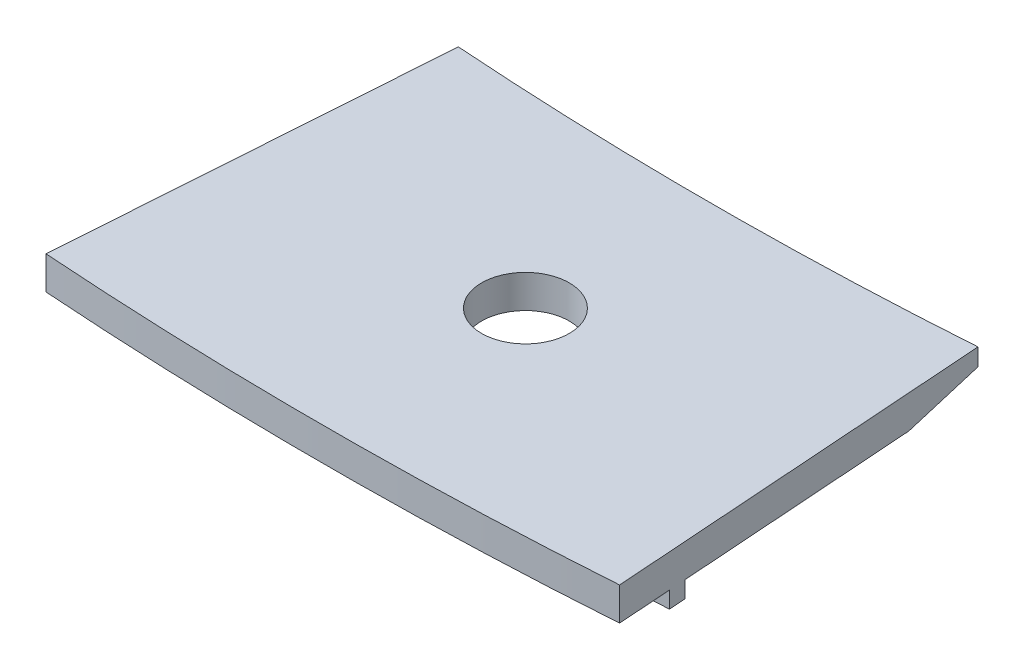
ISO-10303-21;
HEADER;
FILE_DESCRIPTION(('STEP AP214'),'2;1');
FILE_NAME('part.step','',(''),(''),'','','');
FILE_SCHEMA(('AUTOMOTIVE_DESIGN { 1 0 10303 214 1 1 1 1 }'));
ENDSEC;
DATA;
#1=APPLICATION_CONTEXT('core data for automotive mechanical design processes');
#2=APPLICATION_PROTOCOL_DEFINITION('international standard','automotive_design',2000,#1);
#3=PRODUCT_CONTEXT('',#1,'mechanical');
#4=PRODUCT('Part','Part','',(#3));
#5=PRODUCT_RELATED_PRODUCT_CATEGORY('part','',(#4));
#6=PRODUCT_DEFINITION_FORMATION('','',#4);
#7=PRODUCT_DEFINITION_CONTEXT('part definition',#1,'design');
#8=PRODUCT_DEFINITION('design','',#6,#7);
#9=PRODUCT_DEFINITION_SHAPE('','',#8);
#10=(LENGTH_UNIT() NAMED_UNIT(*) SI_UNIT(.MILLI.,.METRE.));
#11=(NAMED_UNIT(*) PLANE_ANGLE_UNIT() SI_UNIT($,.RADIAN.));
#12=(NAMED_UNIT(*) SI_UNIT($,.STERADIAN.) SOLID_ANGLE_UNIT());
#13=UNCERTAINTY_MEASURE_WITH_UNIT(LENGTH_MEASURE(1.E-05),#10,'distance_accuracy_value','');
#14=(GEOMETRIC_REPRESENTATION_CONTEXT(3) GLOBAL_UNCERTAINTY_ASSIGNED_CONTEXT((#13)) GLOBAL_UNIT_ASSIGNED_CONTEXT((#10,
#11,#12)) REPRESENTATION_CONTEXT('',''));
#15=CARTESIAN_POINT('',(0.,0.,0.));
#16=DIRECTION('',(0.,0.,1.));
#17=DIRECTION('',(1.,0.,0.));
#18=AXIS2_PLACEMENT_3D('',#15,#16,#17);
#19=CARTESIAN_POINT('',(4.61295817497898E-12,0.,-3.33066907387441E-13));
#20=DIRECTION('',(0.,-1.,0.));
#21=DIRECTION('',(0.,0.,-1.));
#22=AXIS2_PLACEMENT_3D('',#19,#20,#21);
#23=PLANE('',#22);
#24=CARTESIAN_POINT('',(0.,0.,0.));
#25=DIRECTION('',(0.,1.,0.));
#26=DIRECTION('',(0.,0.,1.));
#27=AXIS2_PLACEMENT_3D('',#24,#25,#26);
#28=CIRCLE('',#27,244.25);
#29=CARTESIAN_POINT('',(-17.0380187120029,0.,243.655019275962));
#30=VERTEX_POINT('',#29);
#31=CARTESIAN_POINT('',(17.0380187120019,0.,243.655019275962));
#32=VERTEX_POINT('',#31);
#33=EDGE_CURVE('E128',#30,#32,#28,.T.);
#34=ORIENTED_EDGE('',*,*,#33,.F.);
#35=DIRECTION('',(-0.069756473744147,0.,0.997564050259823));
#36=VECTOR('',#35,1.);
#37=CARTESIAN_POINT('',(-15.984695958467,0.,228.591802117048));
#38=LINE('',#37,#36);
#39=CARTESIAN_POINT('',(-16.0195741953391,0.,229.090584142178));
#40=VERTEX_POINT('',#39);
#41=EDGE_CURVE('E157',#40,#30,#38,.T.);
#42=ORIENTED_EDGE('',*,*,#41,.F.);
#43=CARTESIAN_POINT('',(0.,0.,0.));
#44=DIRECTION('',(0.,-1.,0.));
#45=DIRECTION('',(0.,0.,-1.));
#46=AXIS2_PLACEMENT_3D('',#43,#44,#45);
#47=CIRCLE('',#46,229.650000000009);
#48=CARTESIAN_POINT('',(16.0195741953391,0.,229.090584142178));
#49=VERTEX_POINT('',#48);
#50=EDGE_CURVE('E44',#40,#49,#47,.F.);
#51=ORIENTED_EDGE('',*,*,#50,.T.);
#52=DIRECTION('',(-0.0697564737440707,0.,-0.997564050259828));
#53=VECTOR('',#52,1.);
#54=CARTESIAN_POINT('',(15.9846959584671,0.,228.591802117049));
#55=LINE('',#54,#53);
#56=EDGE_CURVE('E51',#32,#49,#55,.T.);
#57=ORIENTED_EDGE('',*,*,#56,.F.);
#58=EDGE_LOOP('',(#34,#42,#51,#57));
#59=FACE_BOUND('',#58,.T.);
#60=CARTESIAN_POINT('',(0.,0.,236.25));
#61=DIRECTION('',(0.,1.,0.));
#62=DIRECTION('',(0.,0.,1.));
#63=AXIS2_PLACEMENT_3D('',#60,#61,#62);
#64=CIRCLE('',#63,2.65000000000001);
#65=CARTESIAN_POINT('',(0.,0.,238.9));
#66=VERTEX_POINT('',#65);
#67=EDGE_CURVE('E140',#66,#66,#64,.T.);
#68=ORIENTED_EDGE('',*,*,#67,.T.);
#69=EDGE_LOOP('',(#68));
#70=FACE_BOUND('',#69,.T.);
#71=ADVANCED_FACE('F35',(#59,#70),#23,.T.);
#72=CARTESIAN_POINT('',(4.61295817497898E-12,2.,-3.33066907387441E-13));
#73=DIRECTION('',(0.,-1.,0.));
#74=DIRECTION('',(0.,0.,-1.));
#75=AXIS2_PLACEMENT_3D('',#72,#73,#74);
#76=PLANE('',#75);
#77=DIRECTION('',(-0.0697564737440707,0.,-0.997564050259828));
#78=VECTOR('',#77,1.);
#79=CARTESIAN_POINT('',(15.9846959584671,2.,228.591802117049));
#80=LINE('',#79,#78);
#81=CARTESIAN_POINT('',(17.3344837254145,2.,247.894666489571));
#82=VERTEX_POINT('',#81);
#83=CARTESIAN_POINT('',(15.7056700634948,2.,224.601545916009));
#84=VERTEX_POINT('',#83);
#85=EDGE_CURVE('E153',#82,#84,#80,.T.);
#86=ORIENTED_EDGE('',*,*,#85,.T.);
#87=CARTESIAN_POINT('',(0.,2.,0.));
#88=DIRECTION('',(0.,-1.,0.));
#89=DIRECTION('',(0.,0.,-1.));
#90=AXIS2_PLACEMENT_3D('',#87,#88,#89);
#91=CIRCLE('',#90,225.150000000009);
#92=CARTESIAN_POINT('',(-15.7056700634852,2.,224.601545916009));
#93=VERTEX_POINT('',#92);
#94=EDGE_CURVE('E129',#84,#93,#91,.T.);
#95=ORIENTED_EDGE('',*,*,#94,.T.);
#96=DIRECTION('',(-0.069756473744147,0.,0.997564050259823));
#97=VECTOR('',#96,1.);
#98=CARTESIAN_POINT('',(-15.984695958467,2.,228.591802117048));
#99=LINE('',#98,#97);
#100=CARTESIAN_POINT('',(-17.3344837254159,2.,247.894666489571));
#101=VERTEX_POINT('',#100);
#102=EDGE_CURVE('E148',#93,#101,#99,.T.);
#103=ORIENTED_EDGE('',*,*,#102,.T.);
#104=CARTESIAN_POINT('',(4.63518112781003E-12,2.,0.));
#105=DIRECTION('',(0.,1.,0.));
#106=DIRECTION('',(0.,0.,-1.));
#107=AXIS2_PLACEMENT_3D('',#104,#105,#106);
#108=CIRCLE('',#107,248.500000000005);
#109=EDGE_CURVE('E150',#101,#82,#108,.T.);
#110=ORIENTED_EDGE('',*,*,#109,.T.);
#111=EDGE_LOOP('',(#86,#95,#103,#110));
#112=FACE_BOUND('',#111,.T.);
#113=CARTESIAN_POINT('',(0.,2.,236.25));
#114=DIRECTION('',(0.,1.,0.));
#115=DIRECTION('',(0.,0.,1.));
#116=AXIS2_PLACEMENT_3D('',#113,#114,#115);
#117=CIRCLE('',#116,2.65000000000001);
#118=CARTESIAN_POINT('',(0.,2.,238.9));
#119=VERTEX_POINT('',#118);
#120=EDGE_CURVE('E142',#119,#119,#117,.T.);
#121=ORIENTED_EDGE('',*,*,#120,.F.);
#122=EDGE_LOOP('',(#121));
#123=FACE_BOUND('',#122,.T.);
#124=ADVANCED_FACE('F186',(#112,#123),#76,.F.);
#125=CARTESIAN_POINT('',(0.,0.,0.));
#126=DIRECTION('',(0.,-1.,0.));
#127=DIRECTION('',(0.,0.,1.));
#128=AXIS2_PLACEMENT_3D('',#125,#126,#127);
#129=CIRCLE('',#128,245.252441898081);
#130=CARTESIAN_POINT('',(17.1079455239453,0.,244.655019275962));
#131=VERTEX_POINT('',#130);
#132=CARTESIAN_POINT('',(-17.1079455239465,0.,244.655019275962));
#133=VERTEX_POINT('',#132);
#134=EDGE_CURVE('E59',#131,#133,#129,.T.);
#135=ORIENTED_EDGE('',*,*,#134,.F.);
#136=CARTESIAN_POINT('',(17.3344837254145,0.,247.894666489571));
#137=VERTEX_POINT('',#136);
#138=EDGE_CURVE('E151',#137,#131,#55,.T.);
#139=ORIENTED_EDGE('',*,*,#138,.F.);
#140=CARTESIAN_POINT('',(4.63518112781003E-12,0.,0.));
#141=DIRECTION('',(0.,1.,0.));
#142=DIRECTION('',(0.,0.,-1.));
#143=AXIS2_PLACEMENT_3D('',#140,#141,#142);
#144=CIRCLE('',#143,248.500000000005);
#145=CARTESIAN_POINT('',(-17.3344837254159,0.,247.894666489571));
#146=VERTEX_POINT('',#145);
#147=EDGE_CURVE('E160',#146,#137,#144,.T.);
#148=ORIENTED_EDGE('',*,*,#147,.F.);
#149=EDGE_CURVE('E145',#133,#146,#38,.T.);
#150=ORIENTED_EDGE('',*,*,#149,.F.);
#151=EDGE_LOOP('',(#135,#139,#148,#150));
#152=FACE_BOUND('',#151,.T.);
#153=ADVANCED_FACE('F193',(#152),#23,.T.);
#154=CARTESIAN_POINT('',(-15.984695958467,2.,228.591802117048));
#155=DIRECTION('',(0.997564050259823,0.,0.069756473744147));
#156=DIRECTION('',(0.069756473744147,0.,-0.997564050259823));
#157=AXIS2_PLACEMENT_3D('',#154,#155,#156);
#158=PLANE('',#157);
#159=DIRECTION('',(0.,1.,0.));
#160=VECTOR('',#159,1.);
#161=CARTESIAN_POINT('',(-15.7056700634852,0.,224.601545916009));
#162=LINE('',#161,#160);
#163=CARTESIAN_POINT('',(-15.7056700634852,0.956504527515105,224.601545916009));
#164=VERTEX_POINT('',#163);
#165=EDGE_CURVE('E138',#164,#93,#162,.T.);
#166=ORIENTED_EDGE('',*,*,#165,.F.);
#167=DIRECTION('',(-0.0682321274284881,-0.207911690817757,0.975764882339944));
#168=VECTOR('',#167,1.);
#169=CARTESIAN_POINT('',(4.9561456326871E-12,48.8136143875219,3.46567463621669E-13));
#170=LINE('',#169,#168);
#171=EDGE_CURVE('E171',#164,#40,#170,.T.);
#172=ORIENTED_EDGE('',*,*,#171,.T.);
#173=ORIENTED_EDGE('',*,*,#41,.T.);
#174=DIRECTION('',(0.,1.,0.));
#175=VECTOR('',#174,1.);
#176=CARTESIAN_POINT('',(-17.0380187120029,-1.,243.655019275962));
#177=LINE('',#176,#175);
#178=CARTESIAN_POINT('',(-17.0380187120029,-1.,243.655019275962));
#179=VERTEX_POINT('',#178);
#180=EDGE_CURVE('E200',#179,#30,#177,.T.);
#181=ORIENTED_EDGE('',*,*,#180,.F.);
#182=DIRECTION('',(0.0697564737441458,0.,-0.997564050259823));
#183=VECTOR('',#182,1.);
#184=CARTESIAN_POINT('',(-17.1079455239465,-1.,244.655019275962));
#185=LINE('',#184,#183);
#186=CARTESIAN_POINT('',(-17.1079455239465,-1.,244.655019275962));
#187=VERTEX_POINT('',#186);
#188=EDGE_CURVE('E122',#187,#179,#185,.T.);
#189=ORIENTED_EDGE('',*,*,#188,.F.);
#190=DIRECTION('',(0.,1.,0.));
#191=VECTOR('',#190,1.);
#192=CARTESIAN_POINT('',(-17.1079455239465,-1.,244.655019275962));
#193=LINE('',#192,#191);
#194=EDGE_CURVE('E134',#187,#133,#193,.T.);
#195=ORIENTED_EDGE('',*,*,#194,.T.);
#196=ORIENTED_EDGE('',*,*,#149,.T.);
#197=DIRECTION('',(0.,-1.,0.));
#198=VECTOR('',#197,1.);
#199=CARTESIAN_POINT('',(-17.3344837254159,2.,247.894666489571));
#200=LINE('',#199,#198);
#201=EDGE_CURVE('E165',#101,#146,#200,.T.);
#202=ORIENTED_EDGE('',*,*,#201,.F.);
#203=ORIENTED_EDGE('',*,*,#102,.F.);
#204=EDGE_LOOP('',(#166,#172,#173,#181,#189,#195,#196,#202,#203));
#205=FACE_BOUND('',#204,.T.);
#206=ADVANCED_FACE('F196',(#205),#158,.F.);
#207=CARTESIAN_POINT('',(4.63518112781003E-12,2.,0.));
#208=DIRECTION('',(0.,-1.,0.));
#209=DIRECTION('',(0.,0.,-1.));
#210=AXIS2_PLACEMENT_3D('',#207,#208,#209);
#211=CYLINDRICAL_SURFACE('',#210,248.500000000005);
#212=ORIENTED_EDGE('',*,*,#147,.T.);
#213=DIRECTION('',(0.,-1.,0.));
#214=VECTOR('',#213,1.);
#215=CARTESIAN_POINT('',(17.3344837254145,2.,247.894666489571));
#216=LINE('',#215,#214);
#217=EDGE_CURVE('E156',#82,#137,#216,.T.);
#218=ORIENTED_EDGE('',*,*,#217,.F.);
#219=ORIENTED_EDGE('',*,*,#109,.F.);
#220=ORIENTED_EDGE('',*,*,#201,.T.);
#221=EDGE_LOOP('',(#212,#218,#219,#220));
#222=FACE_BOUND('',#221,.T.);
#223=ADVANCED_FACE('F194',(#222),#211,.T.);
#224=CARTESIAN_POINT('',(15.9846959584671,2.,228.591802117049));
#225=DIRECTION('',(-0.997564050259828,0.,0.0697564737440707));
#226=DIRECTION('',(0.0697564737440707,0.,0.997564050259828));
#227=AXIS2_PLACEMENT_3D('',#224,#225,#226);
#228=PLANE('',#227);
#229=ORIENTED_EDGE('',*,*,#138,.T.);
#230=DIRECTION('',(0.,1.,0.));
#231=VECTOR('',#230,1.);
#232=CARTESIAN_POINT('',(17.1079455239453,-1.,244.655019275962));
#233=LINE('',#232,#231);
#234=CARTESIAN_POINT('',(17.1079455239453,-1.,244.655019275962));
#235=VERTEX_POINT('',#234);
#236=EDGE_CURVE('E113',#235,#131,#233,.T.);
#237=ORIENTED_EDGE('',*,*,#236,.F.);
#238=DIRECTION('',(0.0697564737432515,0.,0.997564050259885));
#239=VECTOR('',#238,1.);
#240=CARTESIAN_POINT('',(17.1079455239453,-1.,244.655019275962));
#241=LINE('',#240,#239);
#242=CARTESIAN_POINT('',(17.0380187120027,-1.,243.655019275962));
#243=VERTEX_POINT('',#242);
#244=EDGE_CURVE('E106',#243,#235,#241,.T.);
#245=ORIENTED_EDGE('',*,*,#244,.F.);
#246=DIRECTION('',(0.,1.,0.));
#247=VECTOR('',#246,1.);
#248=CARTESIAN_POINT('',(17.0380187120027,-1.,243.655019275962));
#249=LINE('',#248,#247);
#250=EDGE_CURVE('E110',#243,#32,#249,.T.);
#251=ORIENTED_EDGE('',*,*,#250,.T.);
#252=ORIENTED_EDGE('',*,*,#56,.T.);
#253=DIRECTION('',(-0.0682321274284135,0.207911690817757,-0.975764882339949));
#254=VECTOR('',#253,1.);
#255=CARTESIAN_POINT('',(1.26187897882523E-11,48.8136143875219,-8.82391740477112E-13));
#256=LINE('',#255,#254);
#257=CARTESIAN_POINT('',(15.7056700634948,0.956504527515105,224.601545916009));
#258=VERTEX_POINT('',#257);
#259=EDGE_CURVE('E11',#49,#258,#256,.T.);
#260=ORIENTED_EDGE('',*,*,#259,.T.);
#261=DIRECTION('',(0.,1.,0.));
#262=VECTOR('',#261,1.);
#263=CARTESIAN_POINT('',(15.7056700634948,0.,224.601545916009));
#264=LINE('',#263,#262);
#265=EDGE_CURVE('E132',#258,#84,#264,.T.);
#266=ORIENTED_EDGE('',*,*,#265,.T.);
#267=ORIENTED_EDGE('',*,*,#85,.F.);
#268=ORIENTED_EDGE('',*,*,#217,.T.);
#269=EDGE_LOOP('',(#229,#237,#245,#251,#252,#260,#266,#267,#268));
#270=FACE_BOUND('',#269,.T.);
#271=ADVANCED_FACE('F108',(#270),#228,.F.);
#272=CARTESIAN_POINT('',(0.,2.,236.25));
#273=DIRECTION('',(0.,-1.,0.));
#274=DIRECTION('',(0.,0.,-1.));
#275=AXIS2_PLACEMENT_3D('',#272,#273,#274);
#276=CYLINDRICAL_SURFACE('',#275,2.65000000000001);
#277=ORIENTED_EDGE('',*,*,#120,.T.);
#278=EDGE_LOOP('',(#277));
#279=FACE_BOUND('',#278,.T.);
#280=ORIENTED_EDGE('',*,*,#67,.F.);
#281=EDGE_LOOP('',(#280));
#282=FACE_BOUND('',#281,.T.);
#283=ADVANCED_FACE('F231',(#279,#282),#276,.F.);
#284=CARTESIAN_POINT('',(0.,0.,0.));
#285=DIRECTION('',(0.,1.,0.));
#286=DIRECTION('',(0.,0.,1.));
#287=AXIS2_PLACEMENT_3D('',#284,#285,#286);
#288=CYLINDRICAL_SURFACE('',#287,225.150000000009);
#289=ORIENTED_EDGE('',*,*,#265,.F.);
#290=CARTESIAN_POINT('',(0.,0.956504527515105,0.));
#291=DIRECTION('',(0.,-1.,0.));
#292=DIRECTION('',(0.,0.,-1.));
#293=AXIS2_PLACEMENT_3D('',#290,#291,#292);
#294=CIRCLE('',#293,225.150000000009);
#295=EDGE_CURVE('E168',#258,#164,#294,.T.);
#296=ORIENTED_EDGE('',*,*,#295,.T.);
#297=ORIENTED_EDGE('',*,*,#165,.T.);
#298=ORIENTED_EDGE('',*,*,#94,.F.);
#299=EDGE_LOOP('',(#289,#296,#297,#298));
#300=FACE_BOUND('',#299,.T.);
#301=ADVANCED_FACE('F182',(#300),#288,.F.);
#302=CARTESIAN_POINT('',(0.,0.956504527515105,0.));
#303=DIRECTION('',(0.,-1.,0.));
#304=DIRECTION('',(0.,0.,-1.));
#305=AXIS2_PLACEMENT_3D('',#302,#303,#304);
#306=CONICAL_SURFACE('',#305,225.150000000009,1.36135681655558);
#307=ORIENTED_EDGE('',*,*,#259,.F.);
#308=ORIENTED_EDGE('',*,*,#50,.F.);
#309=ORIENTED_EDGE('',*,*,#171,.F.);
#310=ORIENTED_EDGE('',*,*,#295,.F.);
#311=EDGE_LOOP('',(#307,#308,#309,#310));
#312=FACE_BOUND('',#311,.T.);
#313=ADVANCED_FACE('F38',(#312),#306,.F.);
#314=CARTESIAN_POINT('',(0.,-1.,0.));
#315=DIRECTION('',(0.,1.,0.));
#316=DIRECTION('',(0.,0.,1.));
#317=AXIS2_PLACEMENT_3D('',#314,#315,#316);
#318=CYLINDRICAL_SURFACE('',#317,244.25);
#319=ORIENTED_EDGE('',*,*,#33,.T.);
#320=ORIENTED_EDGE('',*,*,#250,.F.);
#321=CARTESIAN_POINT('',(0.,-1.,0.));
#322=DIRECTION('',(0.,1.,0.));
#323=DIRECTION('',(0.,0.,1.));
#324=AXIS2_PLACEMENT_3D('',#321,#322,#323);
#325=CIRCLE('',#324,244.25);
#326=EDGE_CURVE('E117',#179,#243,#325,.T.);
#327=ORIENTED_EDGE('',*,*,#326,.F.);
#328=ORIENTED_EDGE('',*,*,#180,.T.);
#329=EDGE_LOOP('',(#319,#320,#327,#328));
#330=FACE_BOUND('',#329,.T.);
#331=ADVANCED_FACE('F127',(#330),#318,.F.);
#332=CARTESIAN_POINT('',(0.,-1.,0.));
#333=DIRECTION('',(0.,1.,0.));
#334=DIRECTION('',(0.,0.,1.));
#335=AXIS2_PLACEMENT_3D('',#332,#333,#334);
#336=CYLINDRICAL_SURFACE('',#335,245.252441898081);
#337=ORIENTED_EDGE('',*,*,#134,.T.);
#338=ORIENTED_EDGE('',*,*,#194,.F.);
#339=CARTESIAN_POINT('',(0.,-1.,0.));
#340=DIRECTION('',(0.,-1.,0.));
#341=DIRECTION('',(0.,0.,1.));
#342=AXIS2_PLACEMENT_3D('',#339,#340,#341);
#343=CIRCLE('',#342,245.252441898081);
#344=EDGE_CURVE('E116',#235,#187,#343,.T.);
#345=ORIENTED_EDGE('',*,*,#344,.F.);
#346=ORIENTED_EDGE('',*,*,#236,.T.);
#347=EDGE_LOOP('',(#337,#338,#345,#346));
#348=FACE_BOUND('',#347,.T.);
#349=ADVANCED_FACE('F206',(#348),#336,.T.);
#350=CARTESIAN_POINT('',(0.,-1.,0.));
#351=DIRECTION('',(0.,1.,0.));
#352=DIRECTION('',(0.,0.,1.));
#353=AXIS2_PLACEMENT_3D('',#350,#351,#352);
#354=PLANE('',#353);
#355=ORIENTED_EDGE('',*,*,#326,.T.);
#356=ORIENTED_EDGE('',*,*,#244,.T.);
#357=ORIENTED_EDGE('',*,*,#344,.T.);
#358=ORIENTED_EDGE('',*,*,#188,.T.);
#359=EDGE_LOOP('',(#355,#356,#357,#358));
#360=FACE_BOUND('',#359,.T.);
#361=ADVANCED_FACE('F120',(#360),#354,.F.);
#362=CLOSED_SHELL('',(#71,#124,#153,#206,#223,#271,#283,#301,#313,#331,#349,#361));
#363=MANIFOLD_SOLID_BREP('B2',#362);
#364=ADVANCED_BREP_SHAPE_REPRESENTATION('',(#18,#363),#14);
#365=SHAPE_DEFINITION_REPRESENTATION(#9,#364);
ENDSEC;
END-ISO-10303-21;
